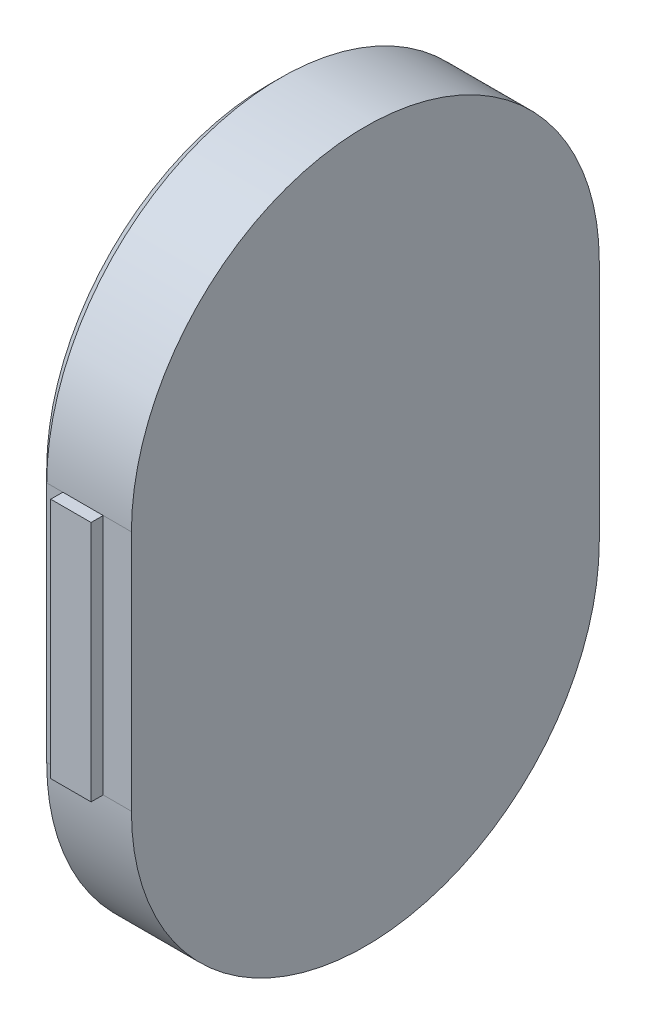
ISO-10303-21;
HEADER;
FILE_DESCRIPTION(('STEP AP214'),'2;1');
FILE_NAME('part.step','',(''),(''),'','','');
FILE_SCHEMA(('AUTOMOTIVE_DESIGN { 1 0 10303 214 1 1 1 1 }'));
ENDSEC;
DATA;
#1=APPLICATION_CONTEXT('core data for automotive mechanical design processes');
#2=APPLICATION_PROTOCOL_DEFINITION('international standard','automotive_design',2000,#1);
#3=PRODUCT_CONTEXT('',#1,'mechanical');
#4=PRODUCT('Part','Part','',(#3));
#5=PRODUCT_RELATED_PRODUCT_CATEGORY('part','',(#4));
#6=PRODUCT_DEFINITION_FORMATION('','',#4);
#7=PRODUCT_DEFINITION_CONTEXT('part definition',#1,'design');
#8=PRODUCT_DEFINITION('design','',#6,#7);
#9=PRODUCT_DEFINITION_SHAPE('','',#8);
#10=(LENGTH_UNIT() NAMED_UNIT(*) SI_UNIT(.MILLI.,.METRE.));
#11=(NAMED_UNIT(*) PLANE_ANGLE_UNIT() SI_UNIT($,.RADIAN.));
#12=(NAMED_UNIT(*) SI_UNIT($,.STERADIAN.) SOLID_ANGLE_UNIT());
#13=UNCERTAINTY_MEASURE_WITH_UNIT(LENGTH_MEASURE(1.E-05),#10,'distance_accuracy_value','');
#14=(GEOMETRIC_REPRESENTATION_CONTEXT(3) GLOBAL_UNCERTAINTY_ASSIGNED_CONTEXT((#13)) GLOBAL_UNIT_ASSIGNED_CONTEXT((#10,
#11,#12)) REPRESENTATION_CONTEXT('',''));
#15=CARTESIAN_POINT('',(0.,0.,0.));
#16=DIRECTION('',(0.,0.,1.));
#17=DIRECTION('',(1.,0.,0.));
#18=AXIS2_PLACEMENT_3D('',#15,#16,#17);
#19=CARTESIAN_POINT('',(-60.6,110.,67.4));
#20=DIRECTION('',(-1.,0.,0.));
#21=DIRECTION('',(0.,0.,1.));
#22=AXIS2_PLACEMENT_3D('',#19,#20,#21);
#23=CYLINDRICAL_SURFACE('',#22,5.8);
#24=DIRECTION('',(-1.,0.,0.));
#25=VECTOR('',#24,1.);
#26=CARTESIAN_POINT('',(-60.6,104.397322068867,68.9));
#27=LINE('',#26,#25);
#28=CARTESIAN_POINT('',(-62.4,104.397322068867,68.9));
#29=VERTEX_POINT('',#28);
#30=CARTESIAN_POINT('',(-62.7,104.397322068867,68.9));
#31=VERTEX_POINT('',#30);
#32=EDGE_CURVE('E221',#29,#31,#27,.T.);
#33=ORIENTED_EDGE('',*,*,#32,.F.);
#34=CARTESIAN_POINT('',(-62.4,110.,67.4));
#35=DIRECTION('',(-1.,0.,0.));
#36=DIRECTION('',(0.,0.,1.));
#37=AXIS2_PLACEMENT_3D('',#34,#35,#36);
#38=CIRCLE('',#37,5.8);
#39=CARTESIAN_POINT('',(-62.4,104.397322068867,65.9));
#40=VERTEX_POINT('',#39);
#41=EDGE_CURVE('E11',#40,#29,#38,.T.);
#42=ORIENTED_EDGE('',*,*,#41,.F.);
#43=DIRECTION('',(-1.,0.,0.));
#44=VECTOR('',#43,1.);
#45=CARTESIAN_POINT('',(-60.6,104.397322068867,65.9));
#46=LINE('',#45,#44);
#47=CARTESIAN_POINT('',(-62.7,104.397322068867,65.9));
#48=VERTEX_POINT('',#47);
#49=EDGE_CURVE('E215',#40,#48,#46,.T.);
#50=ORIENTED_EDGE('',*,*,#49,.T.);
#51=CARTESIAN_POINT('',(-62.7,110.,67.4));
#52=DIRECTION('',(-1.,0.,0.));
#53=DIRECTION('',(0.,0.,1.));
#54=AXIS2_PLACEMENT_3D('',#51,#52,#53);
#55=CIRCLE('',#54,5.8);
#56=CARTESIAN_POINT('',(-62.7,110.,61.6));
#57=VERTEX_POINT('',#56);
#58=EDGE_CURVE('E332',#48,#57,#55,.F.);
#59=ORIENTED_EDGE('',*,*,#58,.T.);
#60=DIRECTION('',(-1.,0.,0.));
#61=VECTOR('',#60,1.);
#62=CARTESIAN_POINT('',(-60.6,110.,61.6));
#63=LINE('',#62,#61);
#64=CARTESIAN_POINT('',(-62.3,110.,61.6));
#65=VERTEX_POINT('',#64);
#66=EDGE_CURVE('E326',#65,#57,#63,.T.);
#67=ORIENTED_EDGE('',*,*,#66,.F.);
#68=CARTESIAN_POINT('',(-61.3,110.,61.6));
#69=VERTEX_POINT('',#68);
#70=EDGE_CURVE('E333',#69,#65,#63,.T.);
#71=ORIENTED_EDGE('',*,*,#70,.F.);
#72=CARTESIAN_POINT('',(-60.6,110.,61.6));
#73=VERTEX_POINT('',#72);
#74=EDGE_CURVE('E328',#73,#69,#63,.T.);
#75=ORIENTED_EDGE('',*,*,#74,.F.);
#76=CARTESIAN_POINT('',(-60.6,110.,67.4));
#77=DIRECTION('',(1.,0.,0.));
#78=DIRECTION('',(0.,0.,1.));
#79=AXIS2_PLACEMENT_3D('',#76,#77,#78);
#80=CIRCLE('',#79,5.8);
#81=CARTESIAN_POINT('',(-60.6,110.,73.2));
#82=VERTEX_POINT('',#81);
#83=EDGE_CURVE('E294',#82,#73,#80,.T.);
#84=ORIENTED_EDGE('',*,*,#83,.F.);
#85=DIRECTION('',(-1.,0.,0.));
#86=VECTOR('',#85,1.);
#87=CARTESIAN_POINT('',(-60.6,110.,73.2));
#88=LINE('',#87,#86);
#89=CARTESIAN_POINT('',(-61.3,110.,73.2));
#90=VERTEX_POINT('',#89);
#91=EDGE_CURVE('E310',#82,#90,#88,.T.);
#92=ORIENTED_EDGE('',*,*,#91,.T.);
#93=CARTESIAN_POINT('',(-62.3,110.,73.2));
#94=VERTEX_POINT('',#93);
#95=EDGE_CURVE('E315',#90,#94,#88,.T.);
#96=ORIENTED_EDGE('',*,*,#95,.T.);
#97=CARTESIAN_POINT('',(-62.7,110.,73.2));
#98=VERTEX_POINT('',#97);
#99=EDGE_CURVE('E309',#94,#98,#88,.T.);
#100=ORIENTED_EDGE('',*,*,#99,.T.);
#101=EDGE_CURVE('E334',#98,#31,#55,.F.);
#102=ORIENTED_EDGE('',*,*,#101,.T.);
#103=EDGE_LOOP('',(#33,#42,#50,#59,#67,#71,#75,#84,#92,#96,#100,#102));
#104=FACE_BOUND('',#103,.T.);
#105=ADVANCED_FACE('F49',(#104),#23,.T.);
#106=CARTESIAN_POINT('',(-63.,110.,67.4));
#107=DIRECTION('',(-1.,0.,0.));
#108=DIRECTION('',(0.,0.,1.));
#109=AXIS2_PLACEMENT_3D('',#106,#107,#108);
#110=PLANE('',#109);
#111=DIRECTION('',(0.,0.,1.));
#112=VECTOR('',#111,1.);
#113=CARTESIAN_POINT('',(-63.,105.4,67.4));
#114=LINE('',#113,#112);
#115=CARTESIAN_POINT('',(-63.,105.4,65.9));
#116=VERTEX_POINT('',#115);
#117=CARTESIAN_POINT('',(-63.,105.4,68.9));
#118=VERTEX_POINT('',#117);
#119=EDGE_CURVE('E59',#116,#118,#114,.T.);
#120=ORIENTED_EDGE('',*,*,#119,.T.);
#121=DIRECTION('',(0.,-1.,0.));
#122=VECTOR('',#121,1.);
#123=CARTESIAN_POINT('',(-63.,110.,68.9));
#124=LINE('',#123,#122);
#125=CARTESIAN_POINT('',(-63.,104.708497377871,68.9));
#126=VERTEX_POINT('',#125);
#127=EDGE_CURVE('E204',#118,#126,#124,.T.);
#128=ORIENTED_EDGE('',*,*,#127,.T.);
#129=CARTESIAN_POINT('',(-63.,110.,67.4));
#130=DIRECTION('',(-1.,0.,0.));
#131=DIRECTION('',(0.,0.,1.));
#132=AXIS2_PLACEMENT_3D('',#129,#130,#131);
#133=CIRCLE('',#132,5.50000000000001);
#134=CARTESIAN_POINT('',(-63.,110.,72.9));
#135=VERTEX_POINT('',#134);
#136=EDGE_CURVE('E347',#126,#135,#133,.T.);
#137=ORIENTED_EDGE('',*,*,#136,.T.);
#138=DIRECTION('',(0.,1.,0.));
#139=VECTOR('',#138,1.);
#140=CARTESIAN_POINT('',(-63.,116.,72.9));
#141=LINE('',#140,#139);
#142=CARTESIAN_POINT('',(-63.,116.,72.9));
#143=VERTEX_POINT('',#142);
#144=EDGE_CURVE('E341',#135,#143,#141,.T.);
#145=ORIENTED_EDGE('',*,*,#144,.T.);
#146=CARTESIAN_POINT('',(-63.,116.,67.4));
#147=DIRECTION('',(-1.,0.,0.));
#148=DIRECTION('',(0.,0.,1.));
#149=AXIS2_PLACEMENT_3D('',#146,#147,#148);
#150=CIRCLE('',#149,5.50000000000001);
#151=CARTESIAN_POINT('',(-63.,116.,61.9));
#152=VERTEX_POINT('',#151);
#153=EDGE_CURVE('E338',#143,#152,#150,.T.);
#154=ORIENTED_EDGE('',*,*,#153,.T.);
#155=DIRECTION('',(0.,-1.,0.));
#156=VECTOR('',#155,1.);
#157=CARTESIAN_POINT('',(-63.,110.,61.9));
#158=LINE('',#157,#156);
#159=CARTESIAN_POINT('',(-63.,110.,61.9));
#160=VERTEX_POINT('',#159);
#161=EDGE_CURVE('E344',#152,#160,#158,.T.);
#162=ORIENTED_EDGE('',*,*,#161,.T.);
#163=CARTESIAN_POINT('',(-63.,104.708497377871,65.9));
#164=VERTEX_POINT('',#163);
#165=EDGE_CURVE('E348',#160,#164,#133,.T.);
#166=ORIENTED_EDGE('',*,*,#165,.T.);
#167=DIRECTION('',(0.,-1.,0.));
#168=VECTOR('',#167,1.);
#169=CARTESIAN_POINT('',(-63.,110.,65.9));
#170=LINE('',#169,#168);
#171=EDGE_CURVE('E66',#116,#164,#170,.T.);
#172=ORIENTED_EDGE('',*,*,#171,.F.);
#173=EDGE_LOOP('',(#120,#128,#137,#145,#154,#162,#166,#172));
#174=FACE_BOUND('',#173,.T.);
#175=ADVANCED_FACE('F451',(#174),#110,.T.);
#176=CARTESIAN_POINT('',(-62.7,110.,67.4));
#177=DIRECTION('',(1.,0.,0.));
#178=DIRECTION('',(0.,0.,-1.));
#179=AXIS2_PLACEMENT_3D('',#176,#177,#178);
#180=CONICAL_SURFACE('',#179,5.8,0.785398163397448);
#181=ORIENTED_EDGE('',*,*,#136,.F.);
#182=CARTESIAN_POINT('',(-64.2371316876853,106.00975611671,68.9));
#183=CARTESIAN_POINT('',(-64.1231499809189,105.887999964926,68.9));
#184=CARTESIAN_POINT('',(-64.0088383775944,105.766553873108,68.9));
#185=CARTESIAN_POINT('',(-63.7796767548246,105.524172135007,68.9));
#186=CARTESIAN_POINT('',(-63.6648267390506,105.403236485253,68.9));
#187=CARTESIAN_POINT('',(-63.3196546032696,105.041034299892,68.9));
#188=CARTESIAN_POINT('',(-63.088704633507,104.800366398064,68.9));
#189=CARTESIAN_POINT('',(-62.6257121524155,104.320093699818,68.9));
#190=CARTESIAN_POINT('',(-62.3936696597395,104.080488885385,68.9));
#191=CARTESIAN_POINT('',(-61.9287883147822,103.602040927902,68.9));
#192=CARTESIAN_POINT('',(-61.6959494424737,103.363197804304,68.9));
#193=CARTESIAN_POINT('',(-61.4628683123147,103.124592929155,68.9));
#194=B_SPLINE_CURVE_WITH_KNOTS('',3,(#182,#183,#184,#185,#186,#187,#188,#189,#190,#191,#192,
#193),.UNSPECIFIED.,.F.,.F.,(4,2,2,2,2,4),(0.,0.500345452602869,1.00068749826315,
2.00134635262799,3.00198818415704,4.00265536751893),.UNSPECIFIED.);
#195=EDGE_CURVE('E387',#126,#31,#194,.T.);
#196=ORIENTED_EDGE('',*,*,#195,.T.);
#197=ORIENTED_EDGE('',*,*,#101,.F.);
#198=DIRECTION('',(-0.707106781186547,0.,-0.707106781186547));
#199=VECTOR('',#198,1.);
#200=CARTESIAN_POINT('',(-62.7,110.,73.2));
#201=LINE('',#200,#199);
#202=EDGE_CURVE('E368',#98,#135,#201,.T.);
#203=ORIENTED_EDGE('',*,*,#202,.T.);
#204=EDGE_LOOP('',(#181,#196,#197,#203));
#205=FACE_BOUND('',#204,.T.);
#206=ADVANCED_FACE('F454',(#205),#180,.T.);
#207=CARTESIAN_POINT('',(-60.6,110.,73.2));
#208=DIRECTION('',(0.,0.,-1.));
#209=DIRECTION('',(-1.,0.,0.));
#210=AXIS2_PLACEMENT_3D('',#207,#208,#209);
#211=PLANE('',#210);
#212=DIRECTION('',(0.,-1.,0.));
#213=VECTOR('',#212,1.);
#214=CARTESIAN_POINT('',(-62.3,110.,73.2));
#215=LINE('',#214,#213);
#216=CARTESIAN_POINT('',(-62.3,116.,73.2));
#217=VERTEX_POINT('',#216);
#218=EDGE_CURVE('E254',#217,#94,#215,.T.);
#219=ORIENTED_EDGE('',*,*,#218,.F.);
#220=DIRECTION('',(-1.,0.,0.));
#221=VECTOR('',#220,1.);
#222=CARTESIAN_POINT('',(-60.6,116.,73.2));
#223=LINE('',#222,#221);
#224=CARTESIAN_POINT('',(-62.7,116.,73.2));
#225=VERTEX_POINT('',#224);
#226=EDGE_CURVE('E314',#217,#225,#223,.T.);
#227=ORIENTED_EDGE('',*,*,#226,.T.);
#228=DIRECTION('',(0.,-1.,0.));
#229=VECTOR('',#228,1.);
#230=CARTESIAN_POINT('',(-62.7,110.,73.2));
#231=LINE('',#230,#229);
#232=EDGE_CURVE('E356',#225,#98,#231,.T.);
#233=ORIENTED_EDGE('',*,*,#232,.T.);
#234=ORIENTED_EDGE('',*,*,#99,.F.);
#235=EDGE_LOOP('',(#219,#227,#233,#234));
#236=FACE_BOUND('',#235,.T.);
#237=ADVANCED_FACE('F459',(#236),#211,.F.);
#238=DIRECTION('',(0.,1.,0.));
#239=VECTOR('',#238,1.);
#240=CARTESIAN_POINT('',(-61.3,110.,73.2));
#241=LINE('',#240,#239);
#242=CARTESIAN_POINT('',(-61.3,116.,73.2));
#243=VERTEX_POINT('',#242);
#244=EDGE_CURVE('E251',#90,#243,#241,.T.);
#245=ORIENTED_EDGE('',*,*,#244,.F.);
#246=ORIENTED_EDGE('',*,*,#91,.F.);
#247=DIRECTION('',(0.,-1.,0.));
#248=VECTOR('',#247,1.);
#249=CARTESIAN_POINT('',(-60.6,110.,73.2));
#250=LINE('',#249,#248);
#251=CARTESIAN_POINT('',(-60.6,116.,73.2));
#252=VERTEX_POINT('',#251);
#253=EDGE_CURVE('E305',#252,#82,#250,.T.);
#254=ORIENTED_EDGE('',*,*,#253,.F.);
#255=EDGE_CURVE('E316',#252,#243,#223,.T.);
#256=ORIENTED_EDGE('',*,*,#255,.T.);
#257=EDGE_LOOP('',(#245,#246,#254,#256));
#258=FACE_BOUND('',#257,.T.);
#259=ADVANCED_FACE('F462',(#258),#211,.F.);
#260=CARTESIAN_POINT('',(-60.6,116.,61.6));
#261=DIRECTION('',(0.,0.,1.));
#262=DIRECTION('',(1.,0.,0.));
#263=AXIS2_PLACEMENT_3D('',#260,#261,#262);
#264=PLANE('',#263);
#265=DIRECTION('',(0.,1.,0.));
#266=VECTOR('',#265,1.);
#267=CARTESIAN_POINT('',(-62.3,116.,61.6));
#268=LINE('',#267,#266);
#269=CARTESIAN_POINT('',(-62.3,116.,61.6));
#270=VERTEX_POINT('',#269);
#271=EDGE_CURVE('E289',#65,#270,#268,.T.);
#272=ORIENTED_EDGE('',*,*,#271,.F.);
#273=ORIENTED_EDGE('',*,*,#66,.T.);
#274=DIRECTION('',(0.,1.,0.));
#275=VECTOR('',#274,1.);
#276=CARTESIAN_POINT('',(-62.7,116.,61.6));
#277=LINE('',#276,#275);
#278=CARTESIAN_POINT('',(-62.7,116.,61.6));
#279=VERTEX_POINT('',#278);
#280=EDGE_CURVE('E352',#57,#279,#277,.T.);
#281=ORIENTED_EDGE('',*,*,#280,.T.);
#282=DIRECTION('',(-1.,0.,0.));
#283=VECTOR('',#282,1.);
#284=CARTESIAN_POINT('',(-60.6,116.,61.6));
#285=LINE('',#284,#283);
#286=EDGE_CURVE('E320',#270,#279,#285,.T.);
#287=ORIENTED_EDGE('',*,*,#286,.F.);
#288=EDGE_LOOP('',(#272,#273,#281,#287));
#289=FACE_BOUND('',#288,.T.);
#290=ADVANCED_FACE('F467',(#289),#264,.F.);
#291=DIRECTION('',(0.,-1.,0.));
#292=VECTOR('',#291,1.);
#293=CARTESIAN_POINT('',(-61.3,116.,61.6));
#294=LINE('',#293,#292);
#295=CARTESIAN_POINT('',(-61.3,116.,61.6));
#296=VERTEX_POINT('',#295);
#297=EDGE_CURVE('E285',#296,#69,#294,.T.);
#298=ORIENTED_EDGE('',*,*,#297,.F.);
#299=CARTESIAN_POINT('',(-60.6,116.,61.6));
#300=VERTEX_POINT('',#299);
#301=EDGE_CURVE('E322',#300,#296,#285,.T.);
#302=ORIENTED_EDGE('',*,*,#301,.F.);
#303=DIRECTION('',(0.,1.,0.));
#304=VECTOR('',#303,1.);
#305=CARTESIAN_POINT('',(-60.6,116.,61.6));
#306=LINE('',#305,#304);
#307=EDGE_CURVE('E298',#73,#300,#306,.T.);
#308=ORIENTED_EDGE('',*,*,#307,.F.);
#309=ORIENTED_EDGE('',*,*,#74,.T.);
#310=EDGE_LOOP('',(#298,#302,#308,#309));
#311=FACE_BOUND('',#310,.T.);
#312=ADVANCED_FACE('F465',(#311),#264,.F.);
#313=CARTESIAN_POINT('',(-60.6,116.,67.4));
#314=DIRECTION('',(-1.,0.,0.));
#315=DIRECTION('',(0.,0.,1.));
#316=AXIS2_PLACEMENT_3D('',#313,#314,#315);
#317=CYLINDRICAL_SURFACE('',#316,5.8);
#318=ORIENTED_EDGE('',*,*,#301,.T.);
#319=EDGE_CURVE('E327',#296,#270,#285,.T.);
#320=ORIENTED_EDGE('',*,*,#319,.T.);
#321=ORIENTED_EDGE('',*,*,#286,.T.);
#322=CARTESIAN_POINT('',(-62.7,116.,67.4));
#323=DIRECTION('',(-1.,0.,0.));
#324=DIRECTION('',(0.,0.,1.));
#325=AXIS2_PLACEMENT_3D('',#322,#323,#324);
#326=CIRCLE('',#325,5.8);
#327=EDGE_CURVE('E360',#279,#225,#326,.F.);
#328=ORIENTED_EDGE('',*,*,#327,.T.);
#329=ORIENTED_EDGE('',*,*,#226,.F.);
#330=EDGE_CURVE('E321',#243,#217,#223,.T.);
#331=ORIENTED_EDGE('',*,*,#330,.F.);
#332=ORIENTED_EDGE('',*,*,#255,.F.);
#333=CARTESIAN_POINT('',(-60.6,116.,67.4));
#334=DIRECTION('',(1.,0.,0.));
#335=DIRECTION('',(0.,0.,1.));
#336=AXIS2_PLACEMENT_3D('',#333,#334,#335);
#337=CIRCLE('',#336,5.8);
#338=EDGE_CURVE('E302',#300,#252,#337,.T.);
#339=ORIENTED_EDGE('',*,*,#338,.F.);
#340=EDGE_LOOP('',(#318,#320,#321,#328,#329,#331,#332,#339));
#341=FACE_BOUND('',#340,.T.);
#342=ADVANCED_FACE('F449',(#341),#317,.T.);
#343=CARTESIAN_POINT('',(-60.6,110.,67.4));
#344=DIRECTION('',(-1.,0.,0.));
#345=DIRECTION('',(0.,0.,1.));
#346=AXIS2_PLACEMENT_3D('',#343,#344,#345);
#347=PLANE('',#346);
#348=ORIENTED_EDGE('',*,*,#83,.T.);
#349=ORIENTED_EDGE('',*,*,#307,.T.);
#350=ORIENTED_EDGE('',*,*,#338,.T.);
#351=ORIENTED_EDGE('',*,*,#253,.T.);
#352=EDGE_LOOP('',(#348,#349,#350,#351));
#353=FACE_BOUND('',#352,.T.);
#354=ADVANCED_FACE('F446',(#353),#347,.F.);
#355=CARTESIAN_POINT('',(-62.7,116.,67.4));
#356=DIRECTION('',(1.,0.,0.));
#357=DIRECTION('',(0.,0.,-1.));
#358=AXIS2_PLACEMENT_3D('',#355,#356,#357);
#359=CONICAL_SURFACE('',#358,5.8,0.785398163397448);
#360=DIRECTION('',(0.707106781186547,0.,-0.707106781186547));
#361=VECTOR('',#360,1.);
#362=CARTESIAN_POINT('',(-63.,116.,61.9));
#363=LINE('',#362,#361);
#364=EDGE_CURVE('E372',#152,#279,#363,.T.);
#365=ORIENTED_EDGE('',*,*,#364,.F.);
#366=ORIENTED_EDGE('',*,*,#153,.F.);
#367=DIRECTION('',(-0.707106781186547,0.,-0.707106781186547));
#368=VECTOR('',#367,1.);
#369=CARTESIAN_POINT('',(-62.7,116.,73.2));
#370=LINE('',#369,#368);
#371=EDGE_CURVE('E299',#225,#143,#370,.T.);
#372=ORIENTED_EDGE('',*,*,#371,.F.);
#373=ORIENTED_EDGE('',*,*,#327,.F.);
#374=EDGE_LOOP('',(#365,#366,#372,#373));
#375=FACE_BOUND('',#374,.T.);
#376=ADVANCED_FACE('F52',(#375),#359,.T.);
#377=CARTESIAN_POINT('',(-62.7,110.,73.2));
#378=DIRECTION('',(-0.707106781186547,0.,0.707106781186547));
#379=DIRECTION('',(0.,1.,0.));
#380=AXIS2_PLACEMENT_3D('',#377,#378,#379);
#381=PLANE('',#380);
#382=ORIENTED_EDGE('',*,*,#371,.T.);
#383=ORIENTED_EDGE('',*,*,#144,.F.);
#384=ORIENTED_EDGE('',*,*,#202,.F.);
#385=ORIENTED_EDGE('',*,*,#232,.F.);
#386=EDGE_LOOP('',(#382,#383,#384,#385));
#387=FACE_BOUND('',#386,.T.);
#388=ADVANCED_FACE('F522',(#387),#381,.T.);
#389=CARTESIAN_POINT('',(-62.7,116.,61.6));
#390=DIRECTION('',(-0.707106781186547,0.,-0.707106781186547));
#391=DIRECTION('',(0.,-1.,0.));
#392=AXIS2_PLACEMENT_3D('',#389,#390,#391);
#393=PLANE('',#392);
#394=ORIENTED_EDGE('',*,*,#364,.T.);
#395=ORIENTED_EDGE('',*,*,#280,.F.);
#396=DIRECTION('',(0.707106781186547,0.,-0.707106781186547));
#397=VECTOR('',#396,1.);
#398=CARTESIAN_POINT('',(-63.,110.,61.9));
#399=LINE('',#398,#397);
#400=EDGE_CURVE('E293',#160,#57,#399,.T.);
#401=ORIENTED_EDGE('',*,*,#400,.F.);
#402=ORIENTED_EDGE('',*,*,#161,.F.);
#403=EDGE_LOOP('',(#394,#395,#401,#402));
#404=FACE_BOUND('',#403,.T.);
#405=ADVANCED_FACE('F508',(#404),#393,.T.);
#406=CARTESIAN_POINT('',(-64.2371316876853,106.00975611671,65.9));
#407=CARTESIAN_POINT('',(-64.1231499809189,105.887999964926,65.9));
#408=CARTESIAN_POINT('',(-64.0088383775944,105.766553873108,65.9));
#409=CARTESIAN_POINT('',(-63.7796767548246,105.524172135007,65.9));
#410=CARTESIAN_POINT('',(-63.6648267390506,105.403236485253,65.9));
#411=CARTESIAN_POINT('',(-63.3196546032696,105.041034299892,65.9));
#412=CARTESIAN_POINT('',(-63.088704633507,104.800366398064,65.9));
#413=CARTESIAN_POINT('',(-62.6257121524155,104.320093699818,65.9));
#414=CARTESIAN_POINT('',(-62.3936696597395,104.080488885385,65.9));
#415=CARTESIAN_POINT('',(-61.9287883147822,103.602040927902,65.9));
#416=CARTESIAN_POINT('',(-61.6959494424737,103.363197804304,65.9));
#417=CARTESIAN_POINT('',(-61.4628683123147,103.124592929155,65.9));
#418=B_SPLINE_CURVE_WITH_KNOTS('',3,(#406,#407,#408,#409,#410,#411,#412,#413,#414,#415,#416,
#417),.UNSPECIFIED.,.F.,.F.,(4,2,2,2,2,4),(0.,0.500345452602869,1.00068749826315,
2.00134635262799,3.00198818415704,4.00265536751893),.UNSPECIFIED.);
#419=EDGE_CURVE('E364',#164,#48,#418,.T.);
#420=ORIENTED_EDGE('',*,*,#419,.F.);
#421=ORIENTED_EDGE('',*,*,#165,.F.);
#422=ORIENTED_EDGE('',*,*,#400,.T.);
#423=ORIENTED_EDGE('',*,*,#58,.F.);
#424=EDGE_LOOP('',(#420,#421,#422,#423));
#425=FACE_BOUND('',#424,.T.);
#426=ADVANCED_FACE('F394',(#425),#180,.T.);
#427=CARTESIAN_POINT('',(-62.3,116.,61.61));
#428=DIRECTION('',(0.,-1.,0.));
#429=DIRECTION('',(0.,0.,-1.));
#430=AXIS2_PLACEMENT_3D('',#427,#428,#429);
#431=PLANE('',#430);
#432=DIRECTION('',(0.,0.,-1.));
#433=VECTOR('',#432,1.);
#434=CARTESIAN_POINT('',(-62.3,116.,61.61));
#435=LINE('',#434,#433);
#436=CARTESIAN_POINT('',(-62.3,116.,61.3));
#437=VERTEX_POINT('',#436);
#438=EDGE_CURVE('E273',#270,#437,#435,.T.);
#439=ORIENTED_EDGE('',*,*,#438,.F.);
#440=ORIENTED_EDGE('',*,*,#319,.F.);
#441=DIRECTION('',(0.,0.,-1.));
#442=VECTOR('',#441,1.);
#443=CARTESIAN_POINT('',(-61.3,116.,61.61));
#444=LINE('',#443,#442);
#445=CARTESIAN_POINT('',(-61.3,116.,61.3));
#446=VERTEX_POINT('',#445);
#447=EDGE_CURVE('E276',#296,#446,#444,.T.);
#448=ORIENTED_EDGE('',*,*,#447,.T.);
#449=DIRECTION('',(-1.,0.,0.));
#450=VECTOR('',#449,1.);
#451=CARTESIAN_POINT('',(-62.3,116.,61.3));
#452=LINE('',#451,#450);
#453=EDGE_CURVE('E269',#446,#437,#452,.T.);
#454=ORIENTED_EDGE('',*,*,#453,.T.);
#455=EDGE_LOOP('',(#439,#440,#448,#454));
#456=FACE_BOUND('',#455,.T.);
#457=ADVANCED_FACE('F431',(#456),#431,.F.);
#458=CARTESIAN_POINT('',(-62.3,110.,61.61));
#459=DIRECTION('',(0.,1.,0.));
#460=DIRECTION('',(0.,0.,1.));
#461=AXIS2_PLACEMENT_3D('',#458,#459,#460);
#462=PLANE('',#461);
#463=DIRECTION('',(0.,0.,-1.));
#464=VECTOR('',#463,1.);
#465=CARTESIAN_POINT('',(-61.3,110.,61.61));
#466=LINE('',#465,#464);
#467=CARTESIAN_POINT('',(-61.3,110.,61.3));
#468=VERTEX_POINT('',#467);
#469=EDGE_CURVE('E279',#69,#468,#466,.T.);
#470=ORIENTED_EDGE('',*,*,#469,.F.);
#471=ORIENTED_EDGE('',*,*,#70,.T.);
#472=DIRECTION('',(0.,0.,-1.));
#473=VECTOR('',#472,1.);
#474=CARTESIAN_POINT('',(-62.3,110.,61.61));
#475=LINE('',#474,#473);
#476=CARTESIAN_POINT('',(-62.3,110.,61.3));
#477=VERTEX_POINT('',#476);
#478=EDGE_CURVE('E282',#65,#477,#475,.T.);
#479=ORIENTED_EDGE('',*,*,#478,.T.);
#480=DIRECTION('',(1.,0.,0.));
#481=VECTOR('',#480,1.);
#482=CARTESIAN_POINT('',(-62.3,110.,61.3));
#483=LINE('',#482,#481);
#484=EDGE_CURVE('E261',#477,#468,#483,.T.);
#485=ORIENTED_EDGE('',*,*,#484,.T.);
#486=EDGE_LOOP('',(#470,#471,#479,#485));
#487=FACE_BOUND('',#486,.T.);
#488=ADVANCED_FACE('F434',(#487),#462,.F.);
#489=CARTESIAN_POINT('',(-62.3,110.,61.61));
#490=DIRECTION('',(1.,0.,0.));
#491=DIRECTION('',(0.,0.,-1.));
#492=AXIS2_PLACEMENT_3D('',#489,#490,#491);
#493=PLANE('',#492);
#494=ORIENTED_EDGE('',*,*,#478,.F.);
#495=ORIENTED_EDGE('',*,*,#271,.T.);
#496=ORIENTED_EDGE('',*,*,#438,.T.);
#497=DIRECTION('',(0.,-1.,0.));
#498=VECTOR('',#497,1.);
#499=CARTESIAN_POINT('',(-62.3,110.,61.3));
#500=LINE('',#499,#498);
#501=EDGE_CURVE('E257',#437,#477,#500,.T.);
#502=ORIENTED_EDGE('',*,*,#501,.T.);
#503=EDGE_LOOP('',(#494,#495,#496,#502));
#504=FACE_BOUND('',#503,.T.);
#505=ADVANCED_FACE('F438',(#504),#493,.F.);
#506=CARTESIAN_POINT('',(-61.3,110.,61.61));
#507=DIRECTION('',(-1.,0.,0.));
#508=DIRECTION('',(0.,0.,1.));
#509=AXIS2_PLACEMENT_3D('',#506,#507,#508);
#510=PLANE('',#509);
#511=ORIENTED_EDGE('',*,*,#447,.F.);
#512=ORIENTED_EDGE('',*,*,#297,.T.);
#513=ORIENTED_EDGE('',*,*,#469,.T.);
#514=DIRECTION('',(0.,1.,0.));
#515=VECTOR('',#514,1.);
#516=CARTESIAN_POINT('',(-61.3,110.,61.3));
#517=LINE('',#516,#515);
#518=EDGE_CURVE('E265',#468,#446,#517,.T.);
#519=ORIENTED_EDGE('',*,*,#518,.T.);
#520=EDGE_LOOP('',(#511,#512,#513,#519));
#521=FACE_BOUND('',#520,.T.);
#522=ADVANCED_FACE('F429',(#521),#510,.F.);
#523=CARTESIAN_POINT('',(0.,0.,61.3));
#524=DIRECTION('',(0.,0.,-1.));
#525=DIRECTION('',(-1.,0.,0.));
#526=AXIS2_PLACEMENT_3D('',#523,#524,#525);
#527=PLANE('',#526);
#528=ORIENTED_EDGE('',*,*,#501,.F.);
#529=ORIENTED_EDGE('',*,*,#453,.F.);
#530=ORIENTED_EDGE('',*,*,#518,.F.);
#531=ORIENTED_EDGE('',*,*,#484,.F.);
#532=EDGE_LOOP('',(#528,#529,#530,#531));
#533=FACE_BOUND('',#532,.T.);
#534=ADVANCED_FACE('F416',(#533),#527,.T.);
#535=CARTESIAN_POINT('',(-62.3,116.,73.5));
#536=DIRECTION('',(0.,-1.,0.));
#537=DIRECTION('',(0.,0.,-1.));
#538=AXIS2_PLACEMENT_3D('',#535,#536,#537);
#539=PLANE('',#538);
#540=DIRECTION('',(0.,0.,-1.));
#541=VECTOR('',#540,1.);
#542=CARTESIAN_POINT('',(-61.3,116.,73.5));
#543=LINE('',#542,#541);
#544=CARTESIAN_POINT('',(-61.3,116.,73.5));
#545=VERTEX_POINT('',#544);
#546=EDGE_CURVE('E241',#545,#243,#543,.T.);
#547=ORIENTED_EDGE('',*,*,#546,.T.);
#548=ORIENTED_EDGE('',*,*,#330,.T.);
#549=DIRECTION('',(0.,0.,-1.));
#550=VECTOR('',#549,1.);
#551=CARTESIAN_POINT('',(-62.3,116.,73.5));
#552=LINE('',#551,#550);
#553=CARTESIAN_POINT('',(-62.3,116.,73.5));
#554=VERTEX_POINT('',#553);
#555=EDGE_CURVE('E237',#554,#217,#552,.T.);
#556=ORIENTED_EDGE('',*,*,#555,.F.);
#557=DIRECTION('',(-1.,0.,0.));
#558=VECTOR('',#557,1.);
#559=CARTESIAN_POINT('',(-62.3,116.,73.5));
#560=LINE('',#559,#558);
#561=EDGE_CURVE('E234',#545,#554,#560,.T.);
#562=ORIENTED_EDGE('',*,*,#561,.F.);
#563=EDGE_LOOP('',(#547,#548,#556,#562));
#564=FACE_BOUND('',#563,.T.);
#565=ADVANCED_FACE('F412',(#564),#539,.F.);
#566=CARTESIAN_POINT('',(-62.3,110.,73.5));
#567=DIRECTION('',(0.,1.,0.));
#568=DIRECTION('',(0.,0.,1.));
#569=AXIS2_PLACEMENT_3D('',#566,#567,#568);
#570=PLANE('',#569);
#571=DIRECTION('',(0.,0.,-1.));
#572=VECTOR('',#571,1.);
#573=CARTESIAN_POINT('',(-62.3,110.,73.5));
#574=LINE('',#573,#572);
#575=CARTESIAN_POINT('',(-62.3,110.,73.5));
#576=VERTEX_POINT('',#575);
#577=EDGE_CURVE('E74',#576,#94,#574,.T.);
#578=ORIENTED_EDGE('',*,*,#577,.T.);
#579=ORIENTED_EDGE('',*,*,#95,.F.);
#580=DIRECTION('',(0.,0.,-1.));
#581=VECTOR('',#580,1.);
#582=CARTESIAN_POINT('',(-61.3,110.,73.5));
#583=LINE('',#582,#581);
#584=CARTESIAN_POINT('',(-61.3,110.,73.5));
#585=VERTEX_POINT('',#584);
#586=EDGE_CURVE('E245',#585,#90,#583,.T.);
#587=ORIENTED_EDGE('',*,*,#586,.F.);
#588=DIRECTION('',(1.,0.,0.));
#589=VECTOR('',#588,1.);
#590=CARTESIAN_POINT('',(-62.3,110.,73.5));
#591=LINE('',#590,#589);
#592=EDGE_CURVE('E228',#576,#585,#591,.T.);
#593=ORIENTED_EDGE('',*,*,#592,.F.);
#594=EDGE_LOOP('',(#578,#579,#587,#593));
#595=FACE_BOUND('',#594,.T.);
#596=ADVANCED_FACE('F415',(#595),#570,.F.);
#597=CARTESIAN_POINT('',(-62.3,110.,73.5));
#598=DIRECTION('',(1.,0.,0.));
#599=DIRECTION('',(0.,0.,-1.));
#600=AXIS2_PLACEMENT_3D('',#597,#598,#599);
#601=PLANE('',#600);
#602=ORIENTED_EDGE('',*,*,#555,.T.);
#603=ORIENTED_EDGE('',*,*,#218,.T.);
#604=ORIENTED_EDGE('',*,*,#577,.F.);
#605=DIRECTION('',(0.,-1.,0.));
#606=VECTOR('',#605,1.);
#607=CARTESIAN_POINT('',(-62.3,110.,73.5));
#608=LINE('',#607,#606);
#609=EDGE_CURVE('E224',#554,#576,#608,.T.);
#610=ORIENTED_EDGE('',*,*,#609,.F.);
#611=EDGE_LOOP('',(#602,#603,#604,#610));
#612=FACE_BOUND('',#611,.T.);
#613=ADVANCED_FACE('F420',(#612),#601,.F.);
#614=CARTESIAN_POINT('',(-61.3,110.,73.5));
#615=DIRECTION('',(-1.,0.,0.));
#616=DIRECTION('',(0.,0.,1.));
#617=AXIS2_PLACEMENT_3D('',#614,#615,#616);
#618=PLANE('',#617);
#619=ORIENTED_EDGE('',*,*,#586,.T.);
#620=ORIENTED_EDGE('',*,*,#244,.T.);
#621=ORIENTED_EDGE('',*,*,#546,.F.);
#622=DIRECTION('',(0.,1.,0.));
#623=VECTOR('',#622,1.);
#624=CARTESIAN_POINT('',(-61.3,110.,73.5));
#625=LINE('',#624,#623);
#626=EDGE_CURVE('E231',#585,#545,#625,.T.);
#627=ORIENTED_EDGE('',*,*,#626,.F.);
#628=EDGE_LOOP('',(#619,#620,#621,#627));
#629=FACE_BOUND('',#628,.T.);
#630=ADVANCED_FACE('F410',(#629),#618,.F.);
#631=CARTESIAN_POINT('',(0.,0.,73.5));
#632=DIRECTION('',(0.,0.,-1.));
#633=DIRECTION('',(-1.,0.,0.));
#634=AXIS2_PLACEMENT_3D('',#631,#632,#633);
#635=PLANE('',#634);
#636=ORIENTED_EDGE('',*,*,#609,.T.);
#637=ORIENTED_EDGE('',*,*,#592,.T.);
#638=ORIENTED_EDGE('',*,*,#626,.T.);
#639=ORIENTED_EDGE('',*,*,#561,.T.);
#640=EDGE_LOOP('',(#636,#637,#638,#639));
#641=FACE_BOUND('',#640,.T.);
#642=ADVANCED_FACE('F407',(#641),#635,.F.);
#643=CARTESIAN_POINT('',(-62.4,104.1,68.9));
#644=DIRECTION('',(-1.,0.,0.));
#645=DIRECTION('',(0.,0.,1.));
#646=AXIS2_PLACEMENT_3D('',#643,#644,#645);
#647=PLANE('',#646);
#648=ORIENTED_EDGE('',*,*,#41,.T.);
#649=DIRECTION('',(0.,1.,0.));
#650=VECTOR('',#649,1.);
#651=CARTESIAN_POINT('',(-62.4,104.1,68.9));
#652=LINE('',#651,#650);
#653=CARTESIAN_POINT('',(-62.4,105.4,68.9));
#654=VERTEX_POINT('',#653);
#655=EDGE_CURVE('E182',#29,#654,#652,.T.);
#656=ORIENTED_EDGE('',*,*,#655,.T.);
#657=DIRECTION('',(0.,0.,-1.));
#658=VECTOR('',#657,1.);
#659=CARTESIAN_POINT('',(-62.4,105.4,68.9));
#660=LINE('',#659,#658);
#661=CARTESIAN_POINT('',(-62.4,105.4,65.9));
#662=VERTEX_POINT('',#661);
#663=EDGE_CURVE('E186',#654,#662,#660,.T.);
#664=ORIENTED_EDGE('',*,*,#663,.T.);
#665=DIRECTION('',(0.,1.,0.));
#666=VECTOR('',#665,1.);
#667=CARTESIAN_POINT('',(-62.4,104.1,65.9));
#668=LINE('',#667,#666);
#669=EDGE_CURVE('E208',#40,#662,#668,.T.);
#670=ORIENTED_EDGE('',*,*,#669,.F.);
#671=EDGE_LOOP('',(#648,#656,#664,#670));
#672=FACE_BOUND('',#671,.T.);
#673=ADVANCED_FACE('F184',(#672),#647,.T.);
#674=CARTESIAN_POINT('',(0.,0.,68.9));
#675=DIRECTION('',(0.,0.,-1.));
#676=DIRECTION('',(-1.,0.,0.));
#677=AXIS2_PLACEMENT_3D('',#674,#675,#676);
#678=PLANE('',#677);
#679=ORIENTED_EDGE('',*,*,#32,.T.);
#680=ORIENTED_EDGE('',*,*,#195,.F.);
#681=ORIENTED_EDGE('',*,*,#127,.F.);
#682=DIRECTION('',(-1.,0.,0.));
#683=VECTOR('',#682,1.);
#684=CARTESIAN_POINT('',(-63.1,105.4,68.9));
#685=LINE('',#684,#683);
#686=EDGE_CURVE('E193',#654,#118,#685,.T.);
#687=ORIENTED_EDGE('',*,*,#686,.F.);
#688=ORIENTED_EDGE('',*,*,#655,.F.);
#689=EDGE_LOOP('',(#679,#680,#681,#687,#688));
#690=FACE_BOUND('',#689,.T.);
#691=ADVANCED_FACE('F202',(#690),#678,.T.);
#692=CARTESIAN_POINT('',(0.,0.,65.9));
#693=DIRECTION('',(0.,0.,-1.));
#694=DIRECTION('',(-1.,0.,0.));
#695=AXIS2_PLACEMENT_3D('',#692,#693,#694);
#696=PLANE('',#695);
#697=ORIENTED_EDGE('',*,*,#669,.T.);
#698=DIRECTION('',(-1.,0.,0.));
#699=VECTOR('',#698,1.);
#700=CARTESIAN_POINT('',(-63.1,105.4,65.9));
#701=LINE('',#700,#699);
#702=EDGE_CURVE('E194',#662,#116,#701,.T.);
#703=ORIENTED_EDGE('',*,*,#702,.T.);
#704=ORIENTED_EDGE('',*,*,#171,.T.);
#705=ORIENTED_EDGE('',*,*,#419,.T.);
#706=ORIENTED_EDGE('',*,*,#49,.F.);
#707=EDGE_LOOP('',(#697,#703,#704,#705,#706));
#708=FACE_BOUND('',#707,.T.);
#709=ADVANCED_FACE('F398',(#708),#696,.F.);
#710=CARTESIAN_POINT('',(-63.1,105.4,68.9));
#711=DIRECTION('',(0.,-1.,0.));
#712=DIRECTION('',(0.,0.,-1.));
#713=AXIS2_PLACEMENT_3D('',#710,#711,#712);
#714=PLANE('',#713);
#715=ORIENTED_EDGE('',*,*,#702,.F.);
#716=ORIENTED_EDGE('',*,*,#663,.F.);
#717=ORIENTED_EDGE('',*,*,#686,.T.);
#718=ORIENTED_EDGE('',*,*,#119,.F.);
#719=EDGE_LOOP('',(#715,#716,#717,#718));
#720=FACE_BOUND('',#719,.T.);
#721=ADVANCED_FACE('F198',(#720),#714,.T.);
#722=CLOSED_SHELL('',(#105,#175,#206,#237,#259,#290,#312,#342,#354,#376,#388,#405,#426,#457,
#488,#505,#522,#534,#565,#596,#613,#630,#642,#673,#691,#709,#721));
#723=MANIFOLD_SOLID_BREP('B2',#722);
#724=ADVANCED_BREP_SHAPE_REPRESENTATION('',(#18,#723),#14);
#725=SHAPE_DEFINITION_REPRESENTATION(#9,#724);
ENDSEC;
END-ISO-10303-21;
